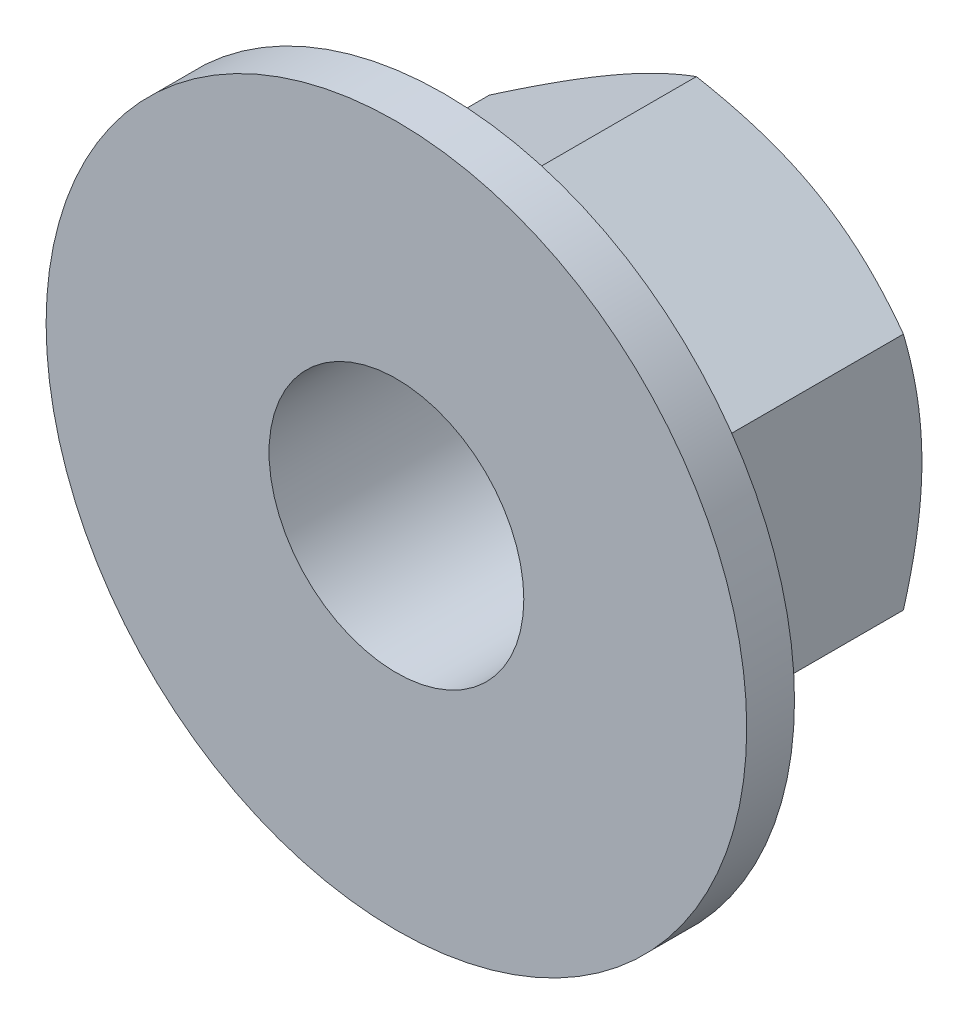
ISO-10303-21;
HEADER;
FILE_DESCRIPTION(('STEP AP214'),'2;1');
FILE_NAME('part.step','',(''),(''),'','','');
FILE_SCHEMA(('AUTOMOTIVE_DESIGN { 1 0 10303 214 1 1 1 1 }'));
ENDSEC;
DATA;
#1=APPLICATION_CONTEXT('core data for automotive mechanical design processes');
#2=APPLICATION_PROTOCOL_DEFINITION('international standard','automotive_design',2000,#1);
#3=PRODUCT_CONTEXT('',#1,'mechanical');
#4=PRODUCT('Part','Part','',(#3));
#5=PRODUCT_RELATED_PRODUCT_CATEGORY('part','',(#4));
#6=PRODUCT_DEFINITION_FORMATION('','',#4);
#7=PRODUCT_DEFINITION_CONTEXT('part definition',#1,'design');
#8=PRODUCT_DEFINITION('design','',#6,#7);
#9=PRODUCT_DEFINITION_SHAPE('','',#8);
#10=(LENGTH_UNIT() NAMED_UNIT(*) SI_UNIT(.MILLI.,.METRE.));
#11=(NAMED_UNIT(*) PLANE_ANGLE_UNIT() SI_UNIT($,.RADIAN.));
#12=(NAMED_UNIT(*) SI_UNIT($,.STERADIAN.) SOLID_ANGLE_UNIT());
#13=UNCERTAINTY_MEASURE_WITH_UNIT(LENGTH_MEASURE(1.E-05),#10,'distance_accuracy_value','');
#14=(GEOMETRIC_REPRESENTATION_CONTEXT(3) GLOBAL_UNCERTAINTY_ASSIGNED_CONTEXT((#13)) GLOBAL_UNIT_ASSIGNED_CONTEXT((#10,
#11,#12)) REPRESENTATION_CONTEXT('',''));
#15=CARTESIAN_POINT('',(0.,0.,0.));
#16=DIRECTION('',(0.,0.,1.));
#17=DIRECTION('',(1.,0.,0.));
#18=AXIS2_PLACEMENT_3D('',#15,#16,#17);
#19=CARTESIAN_POINT('',(6.49999999999998,3.75277674973256,-10.));
#20=DIRECTION('',(0.5,0.86602540378444,0.));
#21=DIRECTION('',(-0.86602540378444,0.5,0.));
#22=AXIS2_PLACEMENT_3D('',#19,#20,#21);
#23=PLANE('',#22);
#24=DIRECTION('',(0.,0.,1.));
#25=VECTOR('',#24,1.);
#26=CARTESIAN_POINT('',(0.,7.50555349946514,-10.));
#27=LINE('',#26,#25);
#28=CARTESIAN_POINT('',(0.,7.50555349946514,-9.41944341639922));
#29=VERTEX_POINT('',#28);
#30=CARTESIAN_POINT('',(0.,7.50555349946515,-3.5));
#31=VERTEX_POINT('',#30);
#32=EDGE_CURVE('E127',#29,#31,#27,.T.);
#33=ORIENTED_EDGE('',*,*,#32,.T.);
#34=DIRECTION('',(0.86602540378444,-0.5,0.));
#35=VECTOR('',#34,1.);
#36=CARTESIAN_POINT('',(6.5,3.75277674973258,-3.5));
#37=LINE('',#36,#35);
#38=CARTESIAN_POINT('',(6.5,3.75277674973258,-3.5));
#39=VERTEX_POINT('',#38);
#40=EDGE_CURVE('E47',#31,#39,#37,.T.);
#41=ORIENTED_EDGE('',*,*,#40,.T.);
#42=DIRECTION('',(0.,0.,1.));
#43=VECTOR('',#42,1.);
#44=CARTESIAN_POINT('',(6.49999999999998,3.75277674973256,-10.));
#45=LINE('',#44,#43);
#46=CARTESIAN_POINT('',(6.49999999999999,3.75277674973257,-9.41944341639922));
#47=VERTEX_POINT('',#46);
#48=EDGE_CURVE('E142',#47,#39,#45,.T.);
#49=ORIENTED_EDGE('',*,*,#48,.F.);
#50=CARTESIAN_POINT('',(-0.000200000000029361,7.50566896951898,-9.41937674819415));
#51=CARTESIAN_POINT('',(0.142677459058849,7.4231786300702,-9.46699557692453));
#52=CARTESIAN_POINT('',(0.286087634534881,7.34038072665458,-9.5124532993973));
#53=CARTESIAN_POINT('',(0.574072631317163,7.17411251123975,-9.59845131797696));
#54=CARTESIAN_POINT('',(0.718647926571232,7.09064192560665,-9.63898949277199));
#55=CARTESIAN_POINT('',(1.15468865052,6.83889369625719,-9.7524289988768));
#56=CARTESIAN_POINT('',(1.44787528284629,6.66962231516081,-9.81695219287127));
#57=CARTESIAN_POINT('',(1.88662374554434,6.41631077211555,-9.89261341645252));
#58=CARTESIAN_POINT('',(2.03087463649466,6.33302748139454,-9.91416714354302));
#59=CARTESIAN_POINT('',(2.32002821713806,6.16608458377293,-9.95030968539389));
#60=CARTESIAN_POINT('',(2.46493084809886,6.08242501078143,-9.96489911554034));
#61=CARTESIAN_POINT('',(2.75498777942829,5.91496056339806,-9.98674124749266));
#62=CARTESIAN_POINT('',(2.90014160605418,5.8311559625217,-9.99400227567791));
#63=CARTESIAN_POINT('',(3.19057533697492,5.66347396979287,-10.0010396974178));
#64=CARTESIAN_POINT('',(3.33585523723633,5.5795965802691,-10.0008163221878));
#65=CARTESIAN_POINT('',(3.73387594242647,5.34979921898453,-9.98991654148481));
#66=CARTESIAN_POINT('',(3.98648646102755,5.20395446807007,-9.97161818213059));
#67=CARTESIAN_POINT('',(4.49002967823566,4.91323365606635,-9.91359365854235));
#68=CARTESIAN_POINT('',(4.74096060593306,4.76835861741225,-9.87384766146177));
#69=CARTESIAN_POINT('',(5.24551722064431,4.47705272008731,-9.77449409679786));
#70=CARTESIAN_POINT('',(5.4990792414359,4.33065861912702,-9.71446557436199));
#71=CARTESIAN_POINT('',(6.00242193575903,4.04005357906493,-9.57822500749015));
#72=CARTESIAN_POINT('',(6.25220905555295,3.89583891821181,-9.50204496583643));
#73=CARTESIAN_POINT('',(6.50019999999999,3.75266127967873,-9.41937674819415));
#74=B_SPLINE_CURVE_WITH_KNOTS('',3,(#50,#51,#52,#53,#54,#55,#56,#57,#58,#59,#60,#61,#62,#63,#64,
#65,#66,#67,#68,#69,#70,#71,#72,#73),.UNSPECIFIED.,.F.,.F.,(4,2,2,2,2,2,2,2,2,2,2,4),(0.,
0.515105052395588,1.03043143507525,2.06322554824262,2.56697389547996,3.07067772176454,
3.57380860368928,4.07692394242521,4.95279354705661,5.82947446853468,6.72559912449737,
7.61996451221047),.UNSPECIFIED.);
#75=CARTESIAN_POINT('',(3.24999999999997,5.62916512459884,-10.));
#76=VERTEX_POINT('',#75);
#77=EDGE_CURVE('E155',#76,#47,#74,.T.);
#78=ORIENTED_EDGE('',*,*,#77,.F.);
#79=EDGE_CURVE('E131',#29,#76,#74,.T.);
#80=ORIENTED_EDGE('',*,*,#79,.F.);
#81=EDGE_LOOP('',(#33,#41,#49,#78,#80));
#82=FACE_BOUND('',#81,.T.);
#83=ADVANCED_FACE('F32',(#82),#23,.T.);
#84=CARTESIAN_POINT('',(6.49999999999998,-3.7527767497326,-10.));
#85=DIRECTION('',(1.,0.,0.));
#86=DIRECTION('',(0.,0.,-1.));
#87=AXIS2_PLACEMENT_3D('',#84,#85,#86);
#88=PLANE('',#87);
#89=ORIENTED_EDGE('',*,*,#48,.T.);
#90=DIRECTION('',(0.,-1.,0.));
#91=VECTOR('',#90,1.);
#92=CARTESIAN_POINT('',(6.5,-3.75277674973259,-3.5));
#93=LINE('',#92,#91);
#94=CARTESIAN_POINT('',(6.5,-3.75277674973259,-3.5));
#95=VERTEX_POINT('',#94);
#96=EDGE_CURVE('E174',#39,#95,#93,.T.);
#97=ORIENTED_EDGE('',*,*,#96,.T.);
#98=DIRECTION('',(0.,0.,1.));
#99=VECTOR('',#98,1.);
#100=CARTESIAN_POINT('',(6.49999999999998,-3.7527767497326,-10.));
#101=LINE('',#100,#99);
#102=CARTESIAN_POINT('',(6.49999999999998,-3.7527767497326,-9.41944341639922));
#103=VERTEX_POINT('',#102);
#104=EDGE_CURVE('E147',#103,#95,#101,.T.);
#105=ORIENTED_EDGE('',*,*,#104,.F.);
#106=CARTESIAN_POINT('',(6.49999999999999,-10.2216195564612,-6.75917237723556));
#107=CARTESIAN_POINT('',(6.49999999999998,-9.93634859615001,-6.89811643752629));
#108=CARTESIAN_POINT('',(6.49999999999997,-9.65043742289961,-7.03576787326371));
#109=CARTESIAN_POINT('',(6.49999999999997,-9.07699440749663,-7.30776067030859));
#110=CARTESIAN_POINT('',(6.49999999999997,-8.78946233005556,-7.44210153501775));
#111=CARTESIAN_POINT('',(6.49999999999997,-8.21102454662175,-7.70739334197199));
#112=CARTESIAN_POINT('',(6.49999999999997,-7.92010907588581,-7.83832306446621));
#113=CARTESIAN_POINT('',(6.49999999999997,-7.33601132206932,-8.09500492739807));
#114=CARTESIAN_POINT('',(6.49999999999997,-7.04282914318512,-8.22075730416751));
#115=CARTESIAN_POINT('',(6.49999999999998,-6.44407061812256,-8.46973850739997));
#116=CARTESIAN_POINT('',(6.49999999999998,-6.13840313304378,-8.59274931503222));
#117=CARTESIAN_POINT('',(6.49999999999998,-5.52354526303206,-8.82979801255181));
#118=CARTESIAN_POINT('',(6.49999999999998,-5.21435449545965,-8.94383491700526));
#119=CARTESIAN_POINT('',(6.49999999999998,-4.59249192815947,-9.16004786961179));
#120=CARTESIAN_POINT('',(6.49999999999998,-4.27982811397596,-9.26224666597209));
#121=CARTESIAN_POINT('',(6.49999999999998,-3.65001600297435,-9.45159809401183));
#122=CARTESIAN_POINT('',(6.49999999999998,-3.33286910471177,-9.53875531072159));
#123=CARTESIAN_POINT('',(6.49999999999998,-2.69555261665502,-9.69351054221063));
#124=CARTESIAN_POINT('',(6.49999999999998,-2.37540809499595,-9.76121017837893));
#125=CARTESIAN_POINT('',(6.49999999999998,-1.73095251059415,-9.87325281415259));
#126=CARTESIAN_POINT('',(6.49999999999998,-1.40664194741557,-9.91759858790499));
#127=CARTESIAN_POINT('',(6.49999999999998,-0.920496851783826,-9.96366560761582));
#128=CARTESIAN_POINT('',(6.49999999999998,-0.759591658458865,-9.97559927817944));
#129=CARTESIAN_POINT('',(6.49999999999998,-0.437413426008802,-9.99265096413211));
#130=CARTESIAN_POINT('',(6.49999999999998,-0.27614039329892,-9.99776909748919));
#131=CARTESIAN_POINT('',(6.49999999999998,0.0464813711372135,-10.0010597885385));
#132=CARTESIAN_POINT('',(6.49999999999998,0.207830105153524,-9.99923212047428));
#133=CARTESIAN_POINT('',(6.49999999999998,0.530304146994181,-9.9886789698951));
#134=CARTESIAN_POINT('',(6.49999999999998,0.691429444193183,-9.97995316990143));
#135=CARTESIAN_POINT('',(6.49999999999998,1.07422179791738,-9.95121608347482));
#136=CARTESIAN_POINT('',(6.49999999999998,1.29566683548487,-9.92817922771309));
#137=CARTESIAN_POINT('',(6.49999999999998,1.73699626710496,-9.87029861627505));
#138=CARTESIAN_POINT('',(6.49999999999998,1.95688046377907,-9.83545339358294));
#139=CARTESIAN_POINT('',(6.49999999999998,2.61386488784073,-9.71504797960542));
#140=CARTESIAN_POINT('',(6.49999999999998,3.04810276122715,-9.61363461170353));
#141=CARTESIAN_POINT('',(6.49999999999998,3.69808358564956,-9.4366040997128));
#142=CARTESIAN_POINT('',(6.49999999999998,3.91715814361853,-9.37250758181063));
#143=CARTESIAN_POINT('',(6.49999999999998,4.35318019714449,-9.23738224990629));
#144=CARTESIAN_POINT('',(6.49999999999998,4.57012767363585,-9.16635337382983));
#145=CARTESIAN_POINT('',(6.49999999999998,5.0019703326152,-9.01852310722843));
#146=CARTESIAN_POINT('',(6.49999999999998,5.2168659932943,-8.94172310064527));
#147=CARTESIAN_POINT('',(6.49999999999998,5.64485227798301,-8.78328979023784));
#148=CARTESIAN_POINT('',(6.49999999999998,5.8579429811708,-8.70165669969505));
#149=CARTESIAN_POINT('',(6.49999999999998,6.31985437137205,-8.51963702144167));
#150=CARTESIAN_POINT('',(6.49999999999998,6.56836940066998,-8.41847681787742));
#151=CARTESIAN_POINT('',(6.49999999999997,7.06350131313619,-8.21160122594112));
#152=CARTESIAN_POINT('',(6.49999999999997,7.31011811417828,-8.10588564177325));
#153=CARTESIAN_POINT('',(6.49999999999997,7.80175805365372,-7.89070321798302));
#154=CARTESIAN_POINT('',(6.49999999999997,8.04678090140033,-7.78123571575149));
#155=CARTESIAN_POINT('',(6.49999999999997,8.53542428344722,-7.55921018322803));
#156=CARTESIAN_POINT('',(6.49999999999997,8.77904479226437,-7.44665209698748));
#157=CARTESIAN_POINT('',(6.49999999999997,9.50843983898134,-7.1049895870891));
#158=CARTESIAN_POINT('',(6.49999999999997,9.99241495954153,-6.87204440712177));
#159=CARTESIAN_POINT('',(6.49999999999997,10.9567551379858,-6.39895339478793));
#160=CARTESIAN_POINT('',(6.49999999999997,11.4371205250918,-6.15880822930635));
#161=CARTESIAN_POINT('',(6.49999999999997,12.3963218014929,-5.67263739556702));
#162=CARTESIAN_POINT('',(6.49999999999997,12.875151183265,-5.42659891154));
#163=CARTESIAN_POINT('',(6.49999999999997,13.8307474033439,-4.93053367597066));
#164=CARTESIAN_POINT('',(6.49999999999996,14.3075141997615,-4.68050684390756));
#165=CARTESIAN_POINT('',(6.49999999999996,15.2592374449663,-4.17750166388812));
#166=CARTESIAN_POINT('',(6.49999999999996,15.7341945532098,-3.92452456221299));
#167=CARTESIAN_POINT('',(6.49999999999996,16.6828285309126,-3.41618010207307));
#168=CARTESIAN_POINT('',(6.49999999999996,17.1565053962226,-3.16081273587344));
#169=CARTESIAN_POINT('',(6.49999999999996,18.437520227024,-2.46689097510555));
#170=CARTESIAN_POINT('',(6.49999999999996,19.2438779311272,-2.02652762322983));
#171=CARTESIAN_POINT('',(6.49999999999995,20.8545753374347,-1.14190776001591));
#172=CARTESIAN_POINT('',(6.49999999999996,21.6589147894697,-0.697650794014455));
#173=CARTESIAN_POINT('',(6.49999999999995,23.2625268537538,0.191701739499786));
#174=CARTESIAN_POINT('',(6.49999999999994,24.0618062309297,0.636785118160755));
#175=CARTESIAN_POINT('',(6.49999999999995,25.6590806117084,1.52900888605278));
#176=CARTESIAN_POINT('',(6.49999999999998,26.4570757682503,1.97614900140295));
#177=CARTESIAN_POINT('',(6.50000000000003,27.2546575220168,2.42402100345308));
#178=B_SPLINE_CURVE_WITH_KNOTS('',3,(#106,#107,#108,#109,#110,#111,#112,#113,#114,#115,#116,
#117,#118,#119,#120,#121,#122,#123,#124,#125,#126,#127,#128,#129,#130,#131,#132,#133,#134,#135,
#136,#137,#138,#139,#140,#141,#142,#143,#144,#145,#146,#147,#148,#149,#150,#151,#152,#153,#154,
#155,#156,#157,#158,#159,#160,#161,#162,#163,#164,#165,#166,#167,#168,#169,#170,#171,#172,#173,
#174,#175,#176,#177),.UNSPECIFIED.,.F.,.F.,(4,2,2,2,2,2,2,2,2,2,2,2,2,2,2,2,2,2,2,2,2,2,2,2,2,2,
2,2,2,2,2,2,2,2,2,4),(0.,0.951937860800122,1.90401765726749,2.86104022722268,3.81801906314682,
4.80638297993343,5.79485527900323,6.78139545373962,7.76763437442163,8.74862474701936,
9.72949856391932,10.2134175483645,10.6973281566959,11.1812544935031,11.665203103768,
12.3327499342032,13.00037972793,14.3362213543517,15.0209358941597,15.7056565656555,
16.3902135590063,17.0747403657006,17.8796294123839,18.6845530887566,19.4896196590273,
20.2947008129805,21.9059553078911,23.5170610216885,25.1320626540498,26.7470969330511,
28.3614720517152,29.9758523962734,32.7321361388012,35.4887461427106,38.2332862899081,
40.9774709763921),.UNSPECIFIED.);
#179=CARTESIAN_POINT('',(6.49999999999998,0.,-10.));
#180=VERTEX_POINT('',#179);
#181=EDGE_CURVE('E228',#180,#103,#178,.F.);
#182=ORIENTED_EDGE('',*,*,#181,.F.);
#183=EDGE_CURVE('E233',#47,#180,#178,.F.);
#184=ORIENTED_EDGE('',*,*,#183,.F.);
#185=EDGE_LOOP('',(#89,#97,#105,#182,#184));
#186=FACE_BOUND('',#185,.T.);
#187=ADVANCED_FACE('F235',(#186),#88,.T.);
#188=CARTESIAN_POINT('',(6.49999999999998,-3.7527767497326,-10.));
#189=DIRECTION('',(0.5,-0.86602540378444,0.));
#190=DIRECTION('',(0.86602540378444,0.5,0.));
#191=AXIS2_PLACEMENT_3D('',#188,#189,#190);
#192=PLANE('',#191);
#193=ORIENTED_EDGE('',*,*,#104,.T.);
#194=DIRECTION('',(-0.86602540378444,-0.5,0.));
#195=VECTOR('',#194,1.);
#196=CARTESIAN_POINT('',(6.5,-3.75277674973259,-3.5));
#197=LINE('',#196,#195);
#198=CARTESIAN_POINT('',(0.,-7.50555349946515,-3.5));
#199=VERTEX_POINT('',#198);
#200=EDGE_CURVE('E172',#95,#199,#197,.T.);
#201=ORIENTED_EDGE('',*,*,#200,.T.);
#202=DIRECTION('',(0.,0.,1.));
#203=VECTOR('',#202,1.);
#204=CARTESIAN_POINT('',(0.,-7.50555349946516,-10.));
#205=LINE('',#204,#203);
#206=CARTESIAN_POINT('',(0.,-7.50555349946516,-9.41944341639922));
#207=VERTEX_POINT('',#206);
#208=EDGE_CURVE('E129',#207,#199,#205,.T.);
#209=ORIENTED_EDGE('',*,*,#208,.F.);
#210=CARTESIAN_POINT('',(6.50019999999998,-3.75266127967876,-9.41937674819415));
#211=CARTESIAN_POINT('',(6.3573225409411,-3.83515161912753,-9.46699557692453));
#212=CARTESIAN_POINT('',(6.21391236546506,-3.91794952254315,-9.5124532993973));
#213=CARTESIAN_POINT('',(5.92592736868278,-4.08421773795798,-9.59845131797696));
#214=CARTESIAN_POINT('',(5.78135207342871,-4.16768832359108,-9.63898949277198));
#215=CARTESIAN_POINT('',(5.34531134947994,-4.41943655294055,-9.7524289988768));
#216=CARTESIAN_POINT('',(5.05212471715366,-4.58870793403693,-9.81695219287126));
#217=CARTESIAN_POINT('',(4.6133762544556,-4.84201947708218,-9.89261341645251));
#218=CARTESIAN_POINT('',(4.46912536350528,-4.92530276780319,-9.91416714354301));
#219=CARTESIAN_POINT('',(4.17997178286188,-5.0922456654248,-9.95030968539388));
#220=CARTESIAN_POINT('',(4.03506915190108,-5.1759052384163,-9.96489911554033));
#221=CARTESIAN_POINT('',(3.74501222057165,-5.34336968579967,-9.98674124749265));
#222=CARTESIAN_POINT('',(3.59985839394576,-5.42717428667603,-9.99400227567789));
#223=CARTESIAN_POINT('',(3.30942466302502,-5.59485627940487,-10.0010396974178));
#224=CARTESIAN_POINT('',(3.16414476276361,-5.67873366892863,-10.0008163221878));
#225=CARTESIAN_POINT('',(2.76612405757347,-5.9085310302132,-9.98991654148482));
#226=CARTESIAN_POINT('',(2.5135135389724,-6.05437578112766,-9.97161818213058));
#227=CARTESIAN_POINT('',(2.00997032176429,-6.34509659313138,-9.91359365854232));
#228=CARTESIAN_POINT('',(1.75903939406689,-6.48997163178547,-9.87384766146175));
#229=CARTESIAN_POINT('',(1.25448277935565,-6.78127752911041,-9.77449409679784));
#230=CARTESIAN_POINT('',(1.00092075856406,-6.9276716300707,-9.71446557436196));
#231=CARTESIAN_POINT('',(0.497578064240933,-7.21827667013279,-9.57822500749012));
#232=CARTESIAN_POINT('',(0.247790944447013,-7.36249133098591,-9.50204496583641));
#233=CARTESIAN_POINT('',(-0.000200000000027014,-7.505668969519,-9.41937674819415));
#234=B_SPLINE_CURVE_WITH_KNOTS('',3,(#210,#211,#212,#213,#214,#215,#216,#217,#218,#219,#220,
#221,#222,#223,#224,#225,#226,#227,#228,#229,#230,#231,#232,#233),.UNSPECIFIED.,.F.,.F.,(4,2,2,
2,2,2,2,2,2,2,2,4),(0.,0.515105052395588,1.03043143507525,2.06322554824262,2.56697389547996,
3.07067772176454,3.57380860368928,4.07692394242521,4.9527935470566,5.82947446853466,
6.72559912449736,7.61996451221045),.UNSPECIFIED.);
#235=CARTESIAN_POINT('',(3.24999999999997,-5.62916512459887,-10.));
#236=VERTEX_POINT('',#235);
#237=EDGE_CURVE('E170',#236,#207,#234,.T.);
#238=ORIENTED_EDGE('',*,*,#237,.F.);
#239=EDGE_CURVE('E234',#103,#236,#234,.T.);
#240=ORIENTED_EDGE('',*,*,#239,.F.);
#241=EDGE_LOOP('',(#193,#201,#209,#238,#240));
#242=FACE_BOUND('',#241,.T.);
#243=ADVANCED_FACE('F168',(#242),#192,.T.);
#244=CARTESIAN_POINT('',(-6.50000000000003,-3.7527767497326,-10.));
#245=DIRECTION('',(-0.5,-0.86602540378444,0.));
#246=DIRECTION('',(0.86602540378444,-0.5,0.));
#247=AXIS2_PLACEMENT_3D('',#244,#245,#246);
#248=PLANE('',#247);
#249=ORIENTED_EDGE('',*,*,#208,.T.);
#250=DIRECTION('',(-0.86602540378444,0.5,0.));
#251=VECTOR('',#250,1.);
#252=CARTESIAN_POINT('',(-6.50000000000001,-3.75277674973259,-3.5));
#253=LINE('',#252,#251);
#254=CARTESIAN_POINT('',(-6.50000000000001,-3.75277674973259,-3.5));
#255=VERTEX_POINT('',#254);
#256=EDGE_CURVE('E114',#199,#255,#253,.T.);
#257=ORIENTED_EDGE('',*,*,#256,.T.);
#258=DIRECTION('',(0.,0.,1.));
#259=VECTOR('',#258,1.);
#260=CARTESIAN_POINT('',(-6.50000000000003,-3.7527767497326,-10.));
#261=LINE('',#260,#259);
#262=CARTESIAN_POINT('',(-6.50000000000003,-3.75277674973294,-9.41944341639944));
#263=VERTEX_POINT('',#262);
#264=EDGE_CURVE('E112',#263,#255,#261,.T.);
#265=ORIENTED_EDGE('',*,*,#264,.F.);
#266=CARTESIAN_POINT('',(0.000199999999973729,-7.505668969519,-9.41937674819415));
#267=CARTESIAN_POINT('',(-0.142677459058913,-7.42317863007023,-9.46699557692451));
#268=CARTESIAN_POINT('',(-0.286087634534948,-7.34038072665461,-9.51245329939728));
#269=CARTESIAN_POINT('',(-0.57407263131723,-7.17411251123978,-9.59845131797693));
#270=CARTESIAN_POINT('',(-0.718647926571298,-7.09064192560668,-9.63898949277196));
#271=CARTESIAN_POINT('',(-1.15468865052007,-6.83889369625722,-9.75242899887678));
#272=CARTESIAN_POINT('',(-1.44787528284635,-6.66962231516083,-9.81695219287124));
#273=CARTESIAN_POINT('',(-1.88662374554441,-6.41631077211558,-9.89261341645249));
#274=CARTESIAN_POINT('',(-2.03087463649472,-6.33302748139457,-9.91416714354299));
#275=CARTESIAN_POINT('',(-2.32002821713812,-6.16608458377296,-9.95030968539386));
#276=CARTESIAN_POINT('',(-2.46493084809892,-6.08242501078146,-9.96489911554031));
#277=CARTESIAN_POINT('',(-2.75498777942836,-5.91496056339809,-9.98674124749263));
#278=CARTESIAN_POINT('',(-2.90014160605425,-5.83115596252173,-9.99400227567786));
#279=CARTESIAN_POINT('',(-3.19057533697498,-5.6634739697929,-10.0010396974177));
#280=CARTESIAN_POINT('',(-3.33585523723639,-5.57959658026913,-10.0008163221878));
#281=CARTESIAN_POINT('',(-3.73387594242653,-5.34979921898456,-9.98991654148482));
#282=CARTESIAN_POINT('',(-3.9864864610276,-5.2039544680701,-9.97161818213056));
#283=CARTESIAN_POINT('',(-4.49002967823571,-4.91323365606639,-9.9135936585423));
#284=CARTESIAN_POINT('',(-4.74096060593311,-4.76835861741229,-9.87384766146173));
#285=CARTESIAN_POINT('',(-5.24551722064435,-4.47705272008735,-9.77449409679782));
#286=CARTESIAN_POINT('',(-5.49907924143594,-4.33065861912706,-9.71446557436194));
#287=CARTESIAN_POINT('',(-6.00242193575907,-4.04005357906497,-9.57822500749011));
#288=CARTESIAN_POINT('',(-6.25220905555299,-3.89583891821185,-9.5020449658364));
#289=CARTESIAN_POINT('',(-6.50020000000003,-3.75266127967876,-9.41937674819415));
#290=B_SPLINE_CURVE_WITH_KNOTS('',3,(#266,#267,#268,#269,#270,#271,#272,#273,#274,#275,#276,
#277,#278,#279,#280,#281,#282,#283,#284,#285,#286,#287,#288,#289),.UNSPECIFIED.,.F.,.F.,(4,2,2,
2,2,2,2,2,2,2,2,4),(0.,0.515105052395584,1.03043143507524,2.06322554824262,2.56697389547996,
3.07067772176453,3.57380860368927,4.07692394242519,4.95279354705659,5.82947446853465,
6.72559912449735,7.61996451221043),.UNSPECIFIED.);
#291=CARTESIAN_POINT('',(-3.25000000000003,-5.62916512459887,-10.));
#292=VERTEX_POINT('',#291);
#293=EDGE_CURVE('E218',#292,#263,#290,.T.);
#294=ORIENTED_EDGE('',*,*,#293,.F.);
#295=EDGE_CURVE('E54',#207,#292,#290,.T.);
#296=ORIENTED_EDGE('',*,*,#295,.F.);
#297=EDGE_LOOP('',(#249,#257,#265,#294,#296));
#298=FACE_BOUND('',#297,.T.);
#299=ADVANCED_FACE('F164',(#298),#248,.T.);
#300=CARTESIAN_POINT('',(-6.50000000000003,-3.7527767497326,-10.));
#301=DIRECTION('',(-1.,0.,0.));
#302=DIRECTION('',(0.,0.,1.));
#303=AXIS2_PLACEMENT_3D('',#300,#301,#302);
#304=PLANE('',#303);
#305=ORIENTED_EDGE('',*,*,#264,.T.);
#306=DIRECTION('',(0.,1.,0.));
#307=VECTOR('',#306,1.);
#308=CARTESIAN_POINT('',(-6.50000000000001,-3.75277674973259,-3.5));
#309=LINE('',#308,#307);
#310=CARTESIAN_POINT('',(-6.50000000000002,3.75277674973258,-3.5));
#311=VERTEX_POINT('',#310);
#312=EDGE_CURVE('E105',#255,#311,#309,.T.);
#313=ORIENTED_EDGE('',*,*,#312,.T.);
#314=DIRECTION('',(0.,0.,1.));
#315=VECTOR('',#314,1.);
#316=CARTESIAN_POINT('',(-6.50000000000003,3.75277674973257,-10.));
#317=LINE('',#316,#315);
#318=CARTESIAN_POINT('',(-6.50000000000003,3.75277674973257,-9.41944341639922));
#319=VERTEX_POINT('',#318);
#320=EDGE_CURVE('E109',#319,#311,#317,.T.);
#321=ORIENTED_EDGE('',*,*,#320,.F.);
#322=CARTESIAN_POINT('',(-6.50000000000003,-10.2216195564612,-6.75917237723569));
#323=CARTESIAN_POINT('',(-6.50000000000004,-9.93634859614997,-6.89811643752632));
#324=CARTESIAN_POINT('',(-6.50000000000004,-9.65043742289955,-7.03576787326371));
#325=CARTESIAN_POINT('',(-6.50000000000004,-9.07699440749657,-7.30776067030856));
#326=CARTESIAN_POINT('',(-6.50000000000004,-8.78946233005551,-7.44210153501772));
#327=CARTESIAN_POINT('',(-6.50000000000004,-8.2110245466217,-7.70739334197197));
#328=CARTESIAN_POINT('',(-6.50000000000004,-7.92010907588576,-7.83832306446618));
#329=CARTESIAN_POINT('',(-6.50000000000004,-7.33601132206928,-8.09500492739804));
#330=CARTESIAN_POINT('',(-6.50000000000004,-7.04282914318508,-8.22075730416748));
#331=CARTESIAN_POINT('',(-6.50000000000004,-6.44407061812252,-8.46973850739995));
#332=CARTESIAN_POINT('',(-6.50000000000004,-6.13840313304374,-8.59274931503219));
#333=CARTESIAN_POINT('',(-6.50000000000003,-5.52354526303203,-8.82979801255178));
#334=CARTESIAN_POINT('',(-6.50000000000003,-5.21435449545962,-8.94383491700523));
#335=CARTESIAN_POINT('',(-6.50000000000003,-4.59249192815944,-9.16004786961176));
#336=CARTESIAN_POINT('',(-6.50000000000003,-4.27982811397594,-9.26224666597205));
#337=CARTESIAN_POINT('',(-6.50000000000003,-3.65001600297434,-9.4515980940118));
#338=CARTESIAN_POINT('',(-6.50000000000003,-3.33286910471177,-9.53875531072159));
#339=CARTESIAN_POINT('',(-6.50000000000003,-2.69555261665503,-9.69351054221063));
#340=CARTESIAN_POINT('',(-6.50000000000003,-2.37540809499595,-9.7612101783789));
#341=CARTESIAN_POINT('',(-6.50000000000003,-1.73095251059414,-9.87325281415254));
#342=CARTESIAN_POINT('',(-6.50000000000003,-1.40664194741557,-9.91759858790495));
#343=CARTESIAN_POINT('',(-6.50000000000003,-0.920496851783821,-9.96366560761579));
#344=CARTESIAN_POINT('',(-6.50000000000003,-0.75959165845886,-9.97559927817941));
#345=CARTESIAN_POINT('',(-6.50000000000003,-0.437413426008797,-9.99265096413207));
#346=CARTESIAN_POINT('',(-6.50000000000003,-0.276140393298915,-9.99776909748916));
#347=CARTESIAN_POINT('',(-6.50000000000003,0.0464813711372177,-10.0010597885385));
#348=CARTESIAN_POINT('',(-6.50000000000003,0.207830105153527,-9.99923212047424));
#349=CARTESIAN_POINT('',(-6.50000000000003,0.530304146994184,-9.98867896989507));
#350=CARTESIAN_POINT('',(-6.50000000000003,0.691429444193187,-9.97995316990143));
#351=CARTESIAN_POINT('',(-6.50000000000003,1.07422179791738,-9.95121608347482));
#352=CARTESIAN_POINT('',(-6.50000000000003,1.29566683548486,-9.92817922771307));
#353=CARTESIAN_POINT('',(-6.50000000000003,1.73699626710495,-9.87029861627501));
#354=CARTESIAN_POINT('',(-6.50000000000003,1.95688046377907,-9.8354533935829));
#355=CARTESIAN_POINT('',(-6.50000000000003,2.61386488784072,-9.71504797960539));
#356=CARTESIAN_POINT('',(-6.50000000000003,3.04810276122714,-9.6136346117035));
#357=CARTESIAN_POINT('',(-6.50000000000003,3.69808358564955,-9.43660409971276));
#358=CARTESIAN_POINT('',(-6.50000000000003,3.91715814361853,-9.3725075818106));
#359=CARTESIAN_POINT('',(-6.50000000000003,4.35318019714449,-9.23738224990625));
#360=CARTESIAN_POINT('',(-6.50000000000003,4.57012767363585,-9.1663533738298));
#361=CARTESIAN_POINT('',(-6.50000000000004,5.00197033261519,-9.01852310722839));
#362=CARTESIAN_POINT('',(-6.50000000000004,5.21686599329429,-8.94172310064522));
#363=CARTESIAN_POINT('',(-6.50000000000004,5.64485227798301,-8.78328979023782));
#364=CARTESIAN_POINT('',(-6.50000000000003,5.8579429811708,-8.70165669969504));
#365=CARTESIAN_POINT('',(-6.50000000000003,6.31985437137206,-8.51963702144168));
#366=CARTESIAN_POINT('',(-6.50000000000004,6.56836940066997,-8.4184768178774));
#367=CARTESIAN_POINT('',(-6.50000000000004,7.06350131313617,-8.21160122594108));
#368=CARTESIAN_POINT('',(-6.50000000000004,7.31011811417826,-8.10588564177322));
#369=CARTESIAN_POINT('',(-6.50000000000004,7.8017580536537,-7.89070321798299));
#370=CARTESIAN_POINT('',(-6.50000000000004,8.04678090140031,-7.78123571575146));
#371=CARTESIAN_POINT('',(-6.50000000000004,8.5354242834472,-7.55921018322799));
#372=CARTESIAN_POINT('',(-6.50000000000004,8.77904479226434,-7.44665209698745));
#373=CARTESIAN_POINT('',(-6.50000000000004,9.50843983898131,-7.10498958708906));
#374=CARTESIAN_POINT('',(-6.50000000000004,9.99241495954151,-6.87204440712174));
#375=CARTESIAN_POINT('',(-6.50000000000004,10.9567551379858,-6.3989533947879));
#376=CARTESIAN_POINT('',(-6.50000000000004,11.4371205250917,-6.15880822930632));
#377=CARTESIAN_POINT('',(-6.50000000000004,12.3963218014929,-5.67263739556699));
#378=CARTESIAN_POINT('',(-6.50000000000004,12.8751511832649,-5.42659891153998));
#379=CARTESIAN_POINT('',(-6.50000000000005,13.8307474033438,-4.93053367597063));
#380=CARTESIAN_POINT('',(-6.50000000000005,14.3075141997615,-4.68050684390753));
#381=CARTESIAN_POINT('',(-6.50000000000005,15.2592374449662,-4.17750166388809));
#382=CARTESIAN_POINT('',(-6.50000000000005,15.7341945532098,-3.92452456221296));
#383=CARTESIAN_POINT('',(-6.50000000000005,16.6828285309126,-3.41618010207305));
#384=CARTESIAN_POINT('',(-6.50000000000005,17.1565053962225,-3.16081273587341));
#385=CARTESIAN_POINT('',(-6.50000000000005,18.437520227024,-2.46689097510552));
#386=CARTESIAN_POINT('',(-6.50000000000006,19.2438779311272,-2.0265276232298));
#387=CARTESIAN_POINT('',(-6.50000000000006,20.8545753374346,-1.14190776001588));
#388=CARTESIAN_POINT('',(-6.50000000000006,21.6589147894697,-0.697650794014429));
#389=CARTESIAN_POINT('',(-6.50000000000006,23.2625268537538,0.191701739499812));
#390=CARTESIAN_POINT('',(-6.50000000000007,24.0618062309296,0.636785118160784));
#391=CARTESIAN_POINT('',(-6.50000000000006,25.6590806117084,1.52900888605279));
#392=CARTESIAN_POINT('',(-6.50000000000004,26.4570757682503,1.97614900140294));
#393=CARTESIAN_POINT('',(-6.5,27.2546575220168,2.42402100345301));
#394=B_SPLINE_CURVE_WITH_KNOTS('',3,(#322,#323,#324,#325,#326,#327,#328,#329,#330,#331,#332,
#333,#334,#335,#336,#337,#338,#339,#340,#341,#342,#343,#344,#345,#346,#347,#348,#349,#350,#351,
#352,#353,#354,#355,#356,#357,#358,#359,#360,#361,#362,#363,#364,#365,#366,#367,#368,#369,#370,
#371,#372,#373,#374,#375,#376,#377,#378,#379,#380,#381,#382,#383,#384,#385,#386,#387,#388,#389,
#390,#391,#392,#393),.UNSPECIFIED.,.F.,.F.,(4,2,2,2,2,2,2,2,2,2,2,2,2,2,2,2,2,2,2,2,2,2,2,2,2,2,
2,2,2,2,2,2,2,2,2,4),(0.,0.951937860800109,1.90401765726747,2.86104022722265,3.81801906314679,
4.8063829799334,5.79485527900319,6.78139545373957,7.76763437442157,8.7486247470193,
9.72949856391926,10.2134175483645,10.6973281566959,11.181254493503,11.6652031037679,
12.3327499342032,13.0003797279299,14.3362213543517,15.0209358941596,15.7056565656554,
16.3902135590063,17.0747403657005,17.8796294123838,18.6845530887565,19.4896196590272,
20.2947008129804,21.905955307891,23.5170610216884,25.1320626540497,26.747096933051,
28.361472051715,29.9758523962733,32.732136138801,35.4887461427105,38.233286289908,
40.9774709763919),.UNSPECIFIED.);
#395=CARTESIAN_POINT('',(-6.50000000000003,0.,-10.));
#396=VERTEX_POINT('',#395);
#397=EDGE_CURVE('E194',#396,#319,#394,.T.);
#398=ORIENTED_EDGE('',*,*,#397,.F.);
#399=EDGE_CURVE('E262',#263,#396,#394,.T.);
#400=ORIENTED_EDGE('',*,*,#399,.F.);
#401=EDGE_LOOP('',(#305,#313,#321,#398,#400));
#402=FACE_BOUND('',#401,.T.);
#403=ADVANCED_FACE('F106',(#402),#304,.T.);
#404=CARTESIAN_POINT('',(-6.50000000000003,3.75277674973257,-10.));
#405=DIRECTION('',(-0.5,0.86602540378444,0.));
#406=DIRECTION('',(-0.86602540378444,-0.5,0.));
#407=AXIS2_PLACEMENT_3D('',#404,#405,#406);
#408=PLANE('',#407);
#409=ORIENTED_EDGE('',*,*,#320,.T.);
#410=DIRECTION('',(0.86602540378444,0.5,0.));
#411=VECTOR('',#410,1.);
#412=CARTESIAN_POINT('',(-6.50000000000002,3.75277674973258,-3.5));
#413=LINE('',#412,#411);
#414=EDGE_CURVE('E11',#311,#31,#413,.T.);
#415=ORIENTED_EDGE('',*,*,#414,.T.);
#416=ORIENTED_EDGE('',*,*,#32,.F.);
#417=CARTESIAN_POINT('',(-6.50020000000003,3.75266127967873,-9.41937674819415));
#418=CARTESIAN_POINT('',(-6.35732254094115,3.83515161912751,-9.46699557692451));
#419=CARTESIAN_POINT('',(-6.21391236546511,3.91794952254313,-9.51245329939728));
#420=CARTESIAN_POINT('',(-5.92592736868283,4.08421773795795,-9.59845131797694));
#421=CARTESIAN_POINT('',(-5.78135207342876,4.16768832359106,-9.63898949277196));
#422=CARTESIAN_POINT('',(-5.34531134948,4.41943655294051,-9.75242899887678));
#423=CARTESIAN_POINT('',(-5.05212471715371,4.5887079340369,-9.81695219287125));
#424=CARTESIAN_POINT('',(-4.61337625445566,4.84201947708215,-9.8926134164525));
#425=CARTESIAN_POINT('',(-4.46912536350534,4.92530276780316,-9.914167143543));
#426=CARTESIAN_POINT('',(-4.17997178286194,5.09224566542477,-9.95030968539387));
#427=CARTESIAN_POINT('',(-4.03506915190114,5.17590523841627,-9.96489911554032));
#428=CARTESIAN_POINT('',(-3.74501222057171,5.34336968579964,-9.98674124749265));
#429=CARTESIAN_POINT('',(-3.59985839394582,5.427174286676,-9.99400227567789));
#430=CARTESIAN_POINT('',(-3.30942466302508,5.59485627940483,-10.0010396974178));
#431=CARTESIAN_POINT('',(-3.16414476276368,5.67873366892861,-10.0008163221878));
#432=CARTESIAN_POINT('',(-2.76612405757354,5.90853103021318,-9.98991654148482));
#433=CARTESIAN_POINT('',(-2.51351353897246,6.05437578112764,-9.97161818213058));
#434=CARTESIAN_POINT('',(-2.00997032176435,6.34509659313134,-9.91359365854233));
#435=CARTESIAN_POINT('',(-1.75903939406694,6.48997163178544,-9.87384766146176));
#436=CARTESIAN_POINT('',(-1.2544827793557,6.78127752911038,-9.77449409679785));
#437=CARTESIAN_POINT('',(-1.00092075856411,6.92767163007067,-9.71446557436198));
#438=CARTESIAN_POINT('',(-0.497578064240981,7.21827667013277,-9.57822500749014));
#439=CARTESIAN_POINT('',(-0.247790944447063,7.36249133098589,-9.50204496583642));
#440=CARTESIAN_POINT('',(0.000199999999970374,7.50566896951898,-9.41937674819415));
#441=B_SPLINE_CURVE_WITH_KNOTS('',3,(#417,#418,#419,#420,#421,#422,#423,#424,#425,#426,#427,
#428,#429,#430,#431,#432,#433,#434,#435,#436,#437,#438,#439,#440),.UNSPECIFIED.,.F.,.F.,(4,2,2,
2,2,2,2,2,2,2,2,4),(0.,0.515105052395584,1.03043143507524,2.06322554824261,2.56697389547995,
3.07067772176453,3.57380860368927,4.07692394242519,4.95279354705659,5.82947446853465,
6.72559912449735,7.61996451221045),.UNSPECIFIED.);
#442=CARTESIAN_POINT('',(-3.25000000000004,5.62916512459886,-10.));
#443=VERTEX_POINT('',#442);
#444=EDGE_CURVE('E189',#443,#29,#441,.T.);
#445=ORIENTED_EDGE('',*,*,#444,.F.);
#446=EDGE_CURVE('E126',#319,#443,#441,.T.);
#447=ORIENTED_EDGE('',*,*,#446,.F.);
#448=EDGE_LOOP('',(#409,#415,#416,#445,#447));
#449=FACE_BOUND('',#448,.T.);
#450=ADVANCED_FACE('F123',(#449),#408,.T.);
#451=CARTESIAN_POINT('',(-6.50000000000001,11.2583302491977,0.));
#452=DIRECTION('',(0.,0.,-1.));
#453=DIRECTION('',(-1.,0.,0.));
#454=AXIS2_PLACEMENT_3D('',#451,#452,#453);
#455=PLANE('',#454);
#456=CARTESIAN_POINT('',(0.,0.,0.));
#457=DIRECTION('',(0.,0.,1.));
#458=DIRECTION('',(1.,0.,0.));
#459=AXIS2_PLACEMENT_3D('',#456,#457,#458);
#460=CIRCLE('',#459,4.);
#461=CARTESIAN_POINT('',(4.,0.,0.));
#462=VERTEX_POINT('',#461);
#463=EDGE_CURVE('E181',#462,#462,#460,.T.);
#464=ORIENTED_EDGE('',*,*,#463,.F.);
#465=EDGE_LOOP('',(#464));
#466=FACE_BOUND('',#465,.T.);
#467=CARTESIAN_POINT('',(0.,0.,0.));
#468=DIRECTION('',(0.,0.,1.));
#469=DIRECTION('',(1.,0.,0.));
#470=AXIS2_PLACEMENT_3D('',#467,#468,#469);
#471=CIRCLE('',#470,11.);
#472=CARTESIAN_POINT('',(11.,0.,0.));
#473=VERTEX_POINT('',#472);
#474=EDGE_CURVE('E115',#473,#473,#471,.T.);
#475=ORIENTED_EDGE('',*,*,#474,.T.);
#476=EDGE_LOOP('',(#475));
#477=FACE_BOUND('',#476,.T.);
#478=ADVANCED_FACE('F207',(#466,#477),#455,.F.);
#479=CARTESIAN_POINT('',(0.,0.,0.));
#480=DIRECTION('',(0.,0.,1.));
#481=DIRECTION('',(1.,0.,0.));
#482=AXIS2_PLACEMENT_3D('',#479,#480,#481);
#483=CONICAL_SURFACE('',#482,23.820508075689,1.0471975511966);
#484=ORIENTED_EDGE('',*,*,#397,.T.);
#485=ORIENTED_EDGE('',*,*,#446,.T.);
#486=CARTESIAN_POINT('',(0.,0.,-10.));
#487=DIRECTION('',(0.,0.,-1.));
#488=DIRECTION('',(-1.,0.,0.));
#489=AXIS2_PLACEMENT_3D('',#486,#487,#488);
#490=CIRCLE('',#489,6.5);
#491=EDGE_CURVE('E187',#396,#443,#490,.T.);
#492=ORIENTED_EDGE('',*,*,#491,.F.);
#493=EDGE_LOOP('',(#484,#485,#492));
#494=FACE_BOUND('',#493,.T.);
#495=ADVANCED_FACE('F201',(#494),#483,.T.);
#496=ORIENTED_EDGE('',*,*,#79,.T.);
#497=CARTESIAN_POINT('',(0.,0.,-10.));
#498=DIRECTION('',(0.,0.,-1.));
#499=DIRECTION('',(-1.,0.,0.));
#500=AXIS2_PLACEMENT_3D('',#497,#498,#499);
#501=CIRCLE('',#500,6.5);
#502=EDGE_CURVE('E135',#76,#443,#501,.F.);
#503=ORIENTED_EDGE('',*,*,#502,.T.);
#504=ORIENTED_EDGE('',*,*,#444,.T.);
#505=EDGE_LOOP('',(#496,#503,#504));
#506=FACE_BOUND('',#505,.T.);
#507=ADVANCED_FACE('F206',(#506),#483,.T.);
#508=ORIENTED_EDGE('',*,*,#77,.T.);
#509=ORIENTED_EDGE('',*,*,#183,.T.);
#510=EDGE_CURVE('E141',#180,#76,#501,.F.);
#511=ORIENTED_EDGE('',*,*,#510,.T.);
#512=EDGE_LOOP('',(#508,#509,#511));
#513=FACE_BOUND('',#512,.T.);
#514=ADVANCED_FACE('F256',(#513),#483,.T.);
#515=ORIENTED_EDGE('',*,*,#181,.T.);
#516=ORIENTED_EDGE('',*,*,#239,.T.);
#517=EDGE_CURVE('E139',#236,#180,#501,.F.);
#518=ORIENTED_EDGE('',*,*,#517,.T.);
#519=EDGE_LOOP('',(#515,#516,#518));
#520=FACE_BOUND('',#519,.T.);
#521=ADVANCED_FACE('F264',(#520),#483,.T.);
#522=ORIENTED_EDGE('',*,*,#237,.T.);
#523=ORIENTED_EDGE('',*,*,#295,.T.);
#524=EDGE_CURVE('E134',#292,#236,#501,.F.);
#525=ORIENTED_EDGE('',*,*,#524,.T.);
#526=EDGE_LOOP('',(#522,#523,#525));
#527=FACE_BOUND('',#526,.T.);
#528=ADVANCED_FACE('F265',(#527),#483,.T.);
#529=ORIENTED_EDGE('',*,*,#293,.T.);
#530=ORIENTED_EDGE('',*,*,#399,.T.);
#531=EDGE_CURVE('E40',#396,#292,#501,.F.);
#532=ORIENTED_EDGE('',*,*,#531,.T.);
#533=EDGE_LOOP('',(#529,#530,#532));
#534=FACE_BOUND('',#533,.T.);
#535=ADVANCED_FACE('F209',(#534),#483,.T.);
#536=CARTESIAN_POINT('',(-6.50000000000003,11.2583302491977,-10.));
#537=DIRECTION('',(0.,0.,-1.));
#538=DIRECTION('',(-1.,0.,0.));
#539=AXIS2_PLACEMENT_3D('',#536,#537,#538);
#540=PLANE('',#539);
#541=CARTESIAN_POINT('',(0.,0.,-10.));
#542=DIRECTION('',(0.,0.,1.));
#543=DIRECTION('',(1.,0.,0.));
#544=AXIS2_PLACEMENT_3D('',#541,#542,#543);
#545=CIRCLE('',#544,4.);
#546=CARTESIAN_POINT('',(3.99999999999997,0.,-10.));
#547=VERTEX_POINT('',#546);
#548=EDGE_CURVE('E184',#547,#547,#545,.T.);
#549=ORIENTED_EDGE('',*,*,#548,.T.);
#550=EDGE_LOOP('',(#549));
#551=FACE_BOUND('',#550,.T.);
#552=ORIENTED_EDGE('',*,*,#531,.F.);
#553=ORIENTED_EDGE('',*,*,#491,.T.);
#554=ORIENTED_EDGE('',*,*,#502,.F.);
#555=ORIENTED_EDGE('',*,*,#510,.F.);
#556=ORIENTED_EDGE('',*,*,#517,.F.);
#557=ORIENTED_EDGE('',*,*,#524,.F.);
#558=EDGE_LOOP('',(#552,#553,#554,#555,#556,#557));
#559=FACE_BOUND('',#558,.T.);
#560=ADVANCED_FACE('F238',(#551,#559),#540,.T.);
#561=CARTESIAN_POINT('',(0.,0.,-10.));
#562=DIRECTION('',(0.,0.,1.));
#563=DIRECTION('',(1.,0.,0.));
#564=AXIS2_PLACEMENT_3D('',#561,#562,#563);
#565=CYLINDRICAL_SURFACE('',#564,4.);
#566=ORIENTED_EDGE('',*,*,#548,.F.);
#567=EDGE_LOOP('',(#566));
#568=FACE_BOUND('',#567,.T.);
#569=ORIENTED_EDGE('',*,*,#463,.T.);
#570=EDGE_LOOP('',(#569));
#571=FACE_BOUND('',#570,.T.);
#572=ADVANCED_FACE('F210',(#568,#571),#565,.F.);
#573=CARTESIAN_POINT('',(0.,0.,0.));
#574=DIRECTION('',(0.,0.,1.));
#575=DIRECTION('',(1.,0.,0.));
#576=AXIS2_PLACEMENT_3D('',#573,#574,#575);
#577=CYLINDRICAL_SURFACE('',#576,11.);
#578=ORIENTED_EDGE('',*,*,#474,.F.);
#579=EDGE_LOOP('',(#578));
#580=FACE_BOUND('',#579,.T.);
#581=CARTESIAN_POINT('',(0.,0.,-1.5));
#582=DIRECTION('',(0.,0.,1.));
#583=DIRECTION('',(1.,0.,0.));
#584=AXIS2_PLACEMENT_3D('',#581,#582,#583);
#585=CIRCLE('',#584,11.);
#586=CARTESIAN_POINT('',(11.,0.,-1.49999999999997));
#587=VERTEX_POINT('',#586);
#588=EDGE_CURVE('E409',#587,#587,#585,.T.);
#589=ORIENTED_EDGE('',*,*,#588,.T.);
#590=EDGE_LOOP('',(#589));
#591=FACE_BOUND('',#590,.T.);
#592=ADVANCED_FACE('F331',(#580,#591),#577,.T.);
#593=CARTESIAN_POINT('',(0.,0.,-3.));
#594=DIRECTION('',(0.,0.,1.));
#595=DIRECTION('',(1.,0.,0.));
#596=AXIS2_PLACEMENT_3D('',#593,#594,#595);
#597=CONICAL_SURFACE('',#596,8.,1.10714871779409);
#598=ORIENTED_EDGE('',*,*,#588,.F.);
#599=EDGE_LOOP('',(#598));
#600=FACE_BOUND('',#599,.T.);
#601=CARTESIAN_POINT('',(0.,0.,-3.));
#602=DIRECTION('',(0.,0.,1.));
#603=DIRECTION('',(1.,0.,0.));
#604=AXIS2_PLACEMENT_3D('',#601,#602,#603);
#605=CIRCLE('',#604,8.);
#606=CARTESIAN_POINT('',(7.99999999999999,0.,-2.99999999999998));
#607=VERTEX_POINT('',#606);
#608=EDGE_CURVE('E411',#607,#607,#605,.T.);
#609=ORIENTED_EDGE('',*,*,#608,.T.);
#610=EDGE_LOOP('',(#609));
#611=FACE_BOUND('',#610,.T.);
#612=ADVANCED_FACE('F337',(#600,#611),#597,.T.);
#613=CARTESIAN_POINT('',(0.,0.,0.));
#614=DIRECTION('',(0.,0.,1.));
#615=DIRECTION('',(1.,0.,0.));
#616=AXIS2_PLACEMENT_3D('',#613,#614,#615);
#617=CYLINDRICAL_SURFACE('',#616,8.);
#618=ORIENTED_EDGE('',*,*,#608,.F.);
#619=EDGE_LOOP('',(#618));
#620=FACE_BOUND('',#619,.T.);
#621=CARTESIAN_POINT('',(0.,0.,-3.5));
#622=DIRECTION('',(0.,0.,1.));
#623=DIRECTION('',(1.,0.,0.));
#624=AXIS2_PLACEMENT_3D('',#621,#622,#623);
#625=CIRCLE('',#624,8.);
#626=CARTESIAN_POINT('',(7.99999999999999,0.,-3.49999999999998));
#627=VERTEX_POINT('',#626);
#628=EDGE_CURVE('E416',#627,#627,#625,.T.);
#629=ORIENTED_EDGE('',*,*,#628,.T.);
#630=EDGE_LOOP('',(#629));
#631=FACE_BOUND('',#630,.T.);
#632=ADVANCED_FACE('F346',(#620,#631),#617,.T.);
#633=CARTESIAN_POINT('',(-8.00000000000002,0.,-3.5));
#634=DIRECTION('',(0.,0.,1.));
#635=DIRECTION('',(1.,0.,0.));
#636=AXIS2_PLACEMENT_3D('',#633,#634,#635);
#637=PLANE('',#636);
#638=ORIENTED_EDGE('',*,*,#40,.F.);
#639=ORIENTED_EDGE('',*,*,#414,.F.);
#640=ORIENTED_EDGE('',*,*,#312,.F.);
#641=ORIENTED_EDGE('',*,*,#256,.F.);
#642=ORIENTED_EDGE('',*,*,#200,.F.);
#643=ORIENTED_EDGE('',*,*,#96,.F.);
#644=EDGE_LOOP('',(#638,#639,#640,#641,#642,#643));
#645=FACE_BOUND('',#644,.T.);
#646=ORIENTED_EDGE('',*,*,#628,.F.);
#647=EDGE_LOOP('',(#646));
#648=FACE_BOUND('',#647,.T.);
#649=ADVANCED_FACE('F117',(#645,#648),#637,.F.);
#650=CLOSED_SHELL('',(#83,#187,#243,#299,#403,#450,#478,#495,#507,#514,#521,#528,#535,#560,#572,
#592,#612,#632,#649));
#651=MANIFOLD_SOLID_BREP('B2',#650);
#652=ADVANCED_BREP_SHAPE_REPRESENTATION('',(#18,#651),#14);
#653=SHAPE_DEFINITION_REPRESENTATION(#9,#652);
ENDSEC;
END-ISO-10303-21;
